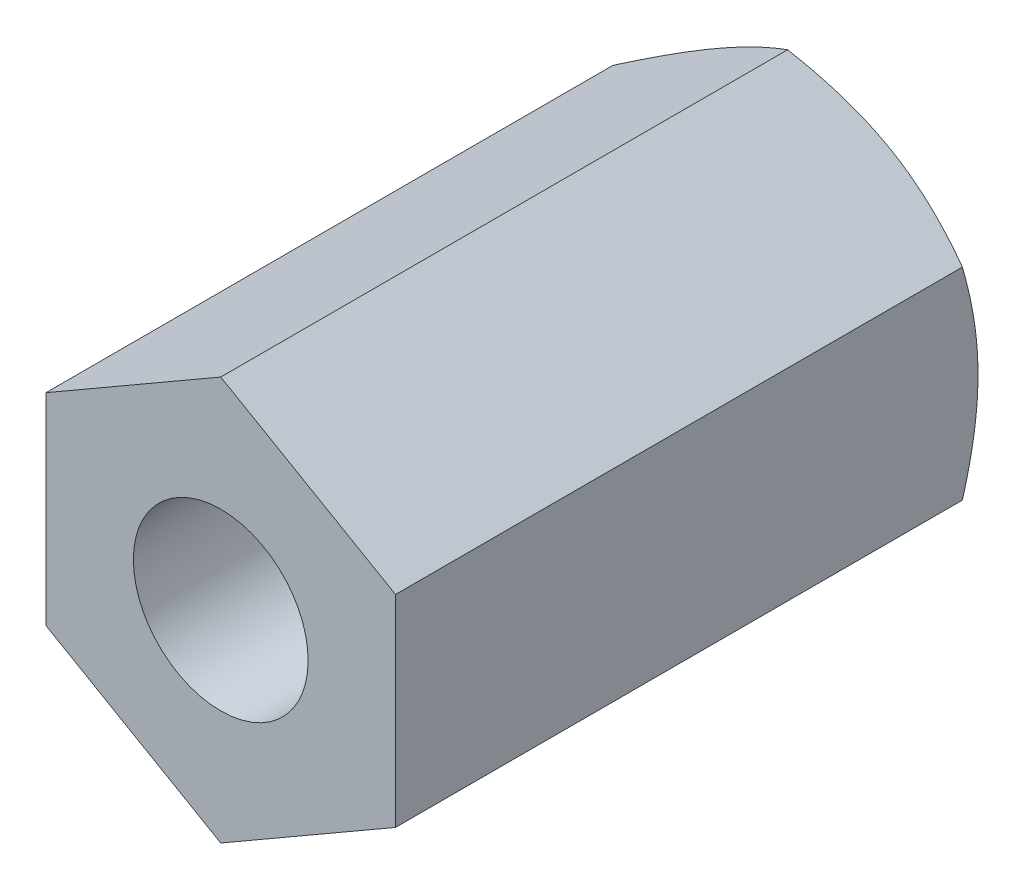
ISO-10303-21;
HEADER;
FILE_DESCRIPTION(('STEP AP214'),'2;1');
FILE_NAME('part.step','',(''),(''),'','','');
FILE_SCHEMA(('AUTOMOTIVE_DESIGN { 1 0 10303 214 1 1 1 1 }'));
ENDSEC;
DATA;
#1=APPLICATION_CONTEXT('core data for automotive mechanical design processes');
#2=APPLICATION_PROTOCOL_DEFINITION('international standard','automotive_design',2000,#1);
#3=PRODUCT_CONTEXT('',#1,'mechanical');
#4=PRODUCT('Part','Part','',(#3));
#5=PRODUCT_RELATED_PRODUCT_CATEGORY('part','',(#4));
#6=PRODUCT_DEFINITION_FORMATION('','',#4);
#7=PRODUCT_DEFINITION_CONTEXT('part definition',#1,'design');
#8=PRODUCT_DEFINITION('design','',#6,#7);
#9=PRODUCT_DEFINITION_SHAPE('','',#8);
#10=(LENGTH_UNIT() NAMED_UNIT(*) SI_UNIT(.MILLI.,.METRE.));
#11=(NAMED_UNIT(*) PLANE_ANGLE_UNIT() SI_UNIT($,.RADIAN.));
#12=(NAMED_UNIT(*) SI_UNIT($,.STERADIAN.) SOLID_ANGLE_UNIT());
#13=UNCERTAINTY_MEASURE_WITH_UNIT(LENGTH_MEASURE(1.E-05),#10,'distance_accuracy_value','');
#14=(GEOMETRIC_REPRESENTATION_CONTEXT(3) GLOBAL_UNCERTAINTY_ASSIGNED_CONTEXT((#13)) GLOBAL_UNIT_ASSIGNED_CONTEXT((#10,
#11,#12)) REPRESENTATION_CONTEXT('',''));
#15=CARTESIAN_POINT('',(0.,0.,0.));
#16=DIRECTION('',(0.,0.,1.));
#17=DIRECTION('',(1.,0.,0.));
#18=AXIS2_PLACEMENT_3D('',#15,#16,#17);
#19=CARTESIAN_POINT('',(3.,1.73205080756888,5.));
#20=DIRECTION('',(-0.499999999999999,-0.866025403784439,0.));
#21=DIRECTION('',(0.866025403784439,-0.499999999999999,0.));
#22=AXIS2_PLACEMENT_3D('',#19,#20,#21);
#23=PLANE('',#22);
#24=CARTESIAN_POINT('',(-0.000200000000001813,3.46421708519159,-4.73198413756899));
#25=CARTESIAN_POINT('',(0.13163520658833,3.38810199317915,-4.77594629554769));
#26=CARTESIAN_POINT('',(0.264608405355248,3.31132988107606,-4.81592841370737));
#27=CARTESIAN_POINT('',(0.532857420002054,3.15645624025988,-4.88571791955453));
#28=CARTESIAN_POINT('',(0.66813800263434,3.078351959461,-4.91550061773462));
#29=CARTESIAN_POINT('',(0.937022602096482,2.92311136358059,-4.96186216078874));
#30=CARTESIAN_POINT('',(1.07058524542946,2.84599893549862,-4.97874955887705));
#31=CARTESIAN_POINT('',(1.33833905729569,2.6914112001411,-4.99891035755148));
#32=CARTESIAN_POINT('',(1.47252925247984,2.61393645482892,-5.00220045221892));
#33=CARTESIAN_POINT('',(1.72327559769581,2.46916798492017,-4.99535946911461));
#34=CARTESIAN_POINT('',(1.83986926497267,2.40185259973206,-4.98690808580738));
#35=CARTESIAN_POINT('',(2.07229698497464,2.2676603930218,-4.96012105699297));
#36=CARTESIAN_POINT('',(2.18813023365133,2.2007840357172,-4.94177625913829));
#37=CARTESIAN_POINT('',(2.42103725705637,2.06631510305815,-4.89591524914667));
#38=CARTESIAN_POINT('',(2.53808155051394,1.99873954872331,-4.86820461473692));
#39=CARTESIAN_POINT('',(2.77042435049913,1.86459637060759,-4.8053122048626));
#40=CARTESIAN_POINT('',(2.88572583417111,1.79802702797161,-4.77014520897844));
#41=CARTESIAN_POINT('',(3.0002,1.73193533751504,-4.73198413756899));
#42=B_SPLINE_CURVE_WITH_KNOTS('',3,(#24,#25,#26,#27,#28,#29,#30,#31,#32,#33,#34,#35,#36,#37,#38,
#39,#40,#41),.UNSPECIFIED.,.F.,.F.,(4,2,2,2,2,2,2,2,4),(0.,0.475539830103041,0.952222784107964,
1.41710776961288,1.88142182298026,2.28572436316091,2.69040156475039,3.10405572063576,
3.5168974940707),.UNSPECIFIED.);
#43=CARTESIAN_POINT('',(0.,3.46410161513775,-4.73205080756888));
#44=VERTEX_POINT('',#43);
#45=CARTESIAN_POINT('',(1.5,2.59807621135332,-5.));
#46=VERTEX_POINT('',#45);
#47=EDGE_CURVE('E59',#44,#46,#42,.T.);
#48=ORIENTED_EDGE('',*,*,#47,.F.);
#49=DIRECTION('',(0.,0.,-1.));
#50=VECTOR('',#49,1.);
#51=CARTESIAN_POINT('',(0.,3.46410161513775,5.));
#52=LINE('',#51,#50);
#53=CARTESIAN_POINT('',(0.,3.46410161513775,5.));
#54=VERTEX_POINT('',#53);
#55=EDGE_CURVE('E152',#54,#44,#52,.T.);
#56=ORIENTED_EDGE('',*,*,#55,.F.);
#57=DIRECTION('',(-0.866025403784439,0.499999999999999,0.));
#58=VECTOR('',#57,1.);
#59=CARTESIAN_POINT('',(3.,1.73205080756888,5.));
#60=LINE('',#59,#58);
#61=CARTESIAN_POINT('',(3.,1.73205080756888,5.));
#62=VERTEX_POINT('',#61);
#63=EDGE_CURVE('E244',#62,#54,#60,.T.);
#64=ORIENTED_EDGE('',*,*,#63,.F.);
#65=DIRECTION('',(0.,0.,-1.));
#66=VECTOR('',#65,1.);
#67=CARTESIAN_POINT('',(3.,1.73205080756888,5.));
#68=LINE('',#67,#66);
#69=CARTESIAN_POINT('',(3.,1.73205080756888,-4.73205080756888));
#70=VERTEX_POINT('',#69);
#71=EDGE_CURVE('E145',#62,#70,#68,.T.);
#72=ORIENTED_EDGE('',*,*,#71,.T.);
#73=EDGE_CURVE('E137',#46,#70,#42,.T.);
#74=ORIENTED_EDGE('',*,*,#73,.F.);
#75=EDGE_LOOP('',(#48,#56,#64,#72,#74));
#76=FACE_BOUND('',#75,.T.);
#77=ADVANCED_FACE('F45',(#76),#23,.F.);
#78=CARTESIAN_POINT('',(0.,3.46410161513775,5.));
#79=DIRECTION('',(0.5,-0.866025403784438,0.));
#80=DIRECTION('',(0.866025403784438,0.5,0.));
#81=AXIS2_PLACEMENT_3D('',#78,#79,#80);
#82=PLANE('',#81);
#83=CARTESIAN_POINT('',(-3.0002,1.73193533751504,-4.73198413756899));
#84=CARTESIAN_POINT('',(-2.86836479341167,1.80805042952748,-4.77594629554769));
#85=CARTESIAN_POINT('',(-2.73539159464475,1.88482254163057,-4.81592841370737));
#86=CARTESIAN_POINT('',(-2.46714257999794,2.03969618244675,-4.88571791955454));
#87=CARTESIAN_POINT('',(-2.33186199736566,2.11780046324563,-4.91550061773462));
#88=CARTESIAN_POINT('',(-2.06297739790352,2.27304105912605,-4.96186216078874));
#89=CARTESIAN_POINT('',(-1.92941475457054,2.35015348720802,-4.97874955887705));
#90=CARTESIAN_POINT('',(-1.66166094270431,2.50474122256553,-4.99891035755148));
#91=CARTESIAN_POINT('',(-1.52747074752016,2.58221596787771,-5.00220045221892));
#92=CARTESIAN_POINT('',(-1.27672440230419,2.72698443778646,-4.99535946911461));
#93=CARTESIAN_POINT('',(-1.16013073502732,2.79429982297457,-4.98690808580738));
#94=CARTESIAN_POINT('',(-0.927703015025365,2.92849202968483,-4.96012105699297));
#95=CARTESIAN_POINT('',(-0.81186976634867,2.99536838698943,-4.94177625913829));
#96=CARTESIAN_POINT('',(-0.578962742943634,3.12983731964848,-4.89591524914667));
#97=CARTESIAN_POINT('',(-0.461918449486061,3.19741287398332,-4.86820461473692));
#98=CARTESIAN_POINT('',(-0.229575649500877,3.33155605209904,-4.8053122048626));
#99=CARTESIAN_POINT('',(-0.114274165828896,3.39812539473502,-4.77014520897844));
#100=CARTESIAN_POINT('',(0.000199999999997777,3.46421708519159,-4.73198413756899));
#101=B_SPLINE_CURVE_WITH_KNOTS('',3,(#83,#84,#85,#86,#87,#88,#89,#90,#91,#92,#93,#94,#95,#96,
#97,#98,#99,#100),.UNSPECIFIED.,.F.,.F.,(4,2,2,2,2,2,2,2,4),(0.,0.475539830103041,
0.952222784107964,1.41710776961288,1.88142182298026,2.28572436316091,2.69040156475039,
3.10405572063576,3.5168974940707),.UNSPECIFIED.);
#102=CARTESIAN_POINT('',(-3.,1.73205080756888,-4.73205080756888));
#103=VERTEX_POINT('',#102);
#104=CARTESIAN_POINT('',(-1.5,2.59807621135332,-5.));
#105=VERTEX_POINT('',#104);
#106=EDGE_CURVE('E61',#103,#105,#101,.T.);
#107=ORIENTED_EDGE('',*,*,#106,.F.);
#108=DIRECTION('',(0.,0.,-1.));
#109=VECTOR('',#108,1.);
#110=CARTESIAN_POINT('',(-3.,1.73205080756888,5.));
#111=LINE('',#110,#109);
#112=CARTESIAN_POINT('',(-3.,1.73205080756888,5.));
#113=VERTEX_POINT('',#112);
#114=EDGE_CURVE('E155',#113,#103,#111,.T.);
#115=ORIENTED_EDGE('',*,*,#114,.F.);
#116=DIRECTION('',(-0.866025403784438,-0.5,0.));
#117=VECTOR('',#116,1.);
#118=CARTESIAN_POINT('',(0.,3.46410161513775,5.));
#119=LINE('',#118,#117);
#120=EDGE_CURVE('E243',#54,#113,#119,.T.);
#121=ORIENTED_EDGE('',*,*,#120,.F.);
#122=ORIENTED_EDGE('',*,*,#55,.T.);
#123=EDGE_CURVE('E169',#105,#44,#101,.T.);
#124=ORIENTED_EDGE('',*,*,#123,.F.);
#125=EDGE_LOOP('',(#107,#115,#121,#122,#124));
#126=FACE_BOUND('',#125,.T.);
#127=ADVANCED_FACE('F174',(#126),#82,.F.);
#128=CARTESIAN_POINT('',(-3.,1.73205080756888,5.));
#129=DIRECTION('',(1.,0.,0.));
#130=DIRECTION('',(0.,0.,-1.));
#131=AXIS2_PLACEMENT_3D('',#128,#129,#130);
#132=PLANE('',#131);
#133=CARTESIAN_POINT('',(-3.,-17.0986930271428,3.29067841549304));
#134=CARTESIAN_POINT('',(-3.,-16.5661103428008,2.98784229867591));
#135=CARTESIAN_POINT('',(-3.,-16.033365391056,2.6852903923022));
#136=CARTESIAN_POINT('',(-3.,-14.9667886017206,2.08070715643592));
#137=CARTESIAN_POINT('',(-3.,-14.4329562155798,1.77867679487407));
#138=CARTESIAN_POINT('',(-3.,-13.352647761221,1.16900379076196));
#139=CARTESIAN_POINT('',(-3.,-12.8061568867149,0.86138737060701));
#140=CARTESIAN_POINT('',(-3.,-11.7128183365851,0.24823332707843));
#141=CARTESIAN_POINT('',(-3.,-11.1659717571849,-0.0573062483819965));
#142=CARTESIAN_POINT('',(-3.,-10.240652439692,-0.571409925426077));
#143=CARTESIAN_POINT('',(-3.,-9.86256119353648,-0.78066029601164));
#144=CARTESIAN_POINT('',(-3.,-9.1054312742815,-1.19743913879986));
#145=CARTESIAN_POINT('',(-3.,-8.72639260479033,-1.40496761754745));
#146=CARTESIAN_POINT('',(-3.,-7.96546318845327,-1.81839754195755));
#147=CARTESIAN_POINT('',(-3.,-7.58356709774657,-2.02428916214036));
#148=CARTESIAN_POINT('',(-3.,-6.81795402493175,-2.43233757901441));
#149=CARTESIAN_POINT('',(-3.,-6.43423776029363,-2.63449571484276));
#150=CARTESIAN_POINT('',(-3.,-5.85971803000353,-2.93164142809243));
#151=CARTESIAN_POINT('',(-3.,-5.67005981376972,-3.02884126328336));
#152=CARTESIAN_POINT('',(-3.,-5.28981734420958,-3.22141007804521));
#153=CARTESIAN_POINT('',(-3.,-5.09923310329799,-3.31677908207676));
#154=CARTESIAN_POINT('',(-3.,-4.71659417975172,-3.50527301981032));
#155=CARTESIAN_POINT('',(-3.,-4.52453769986071,-3.59839431503987));
#156=CARTESIAN_POINT('',(-3.,-4.13890954850645,-3.78142924850615));
#157=CARTESIAN_POINT('',(-3.,-3.94533796761318,-3.87134307672044));
#158=CARTESIAN_POINT('',(-3.,-3.55764682838599,-4.04614454487251));
#159=CARTESIAN_POINT('',(-3.,-3.36354187622502,-4.1310644019764));
#160=CARTESIAN_POINT('',(-3.,-2.97271984041441,-4.29490883972565));
#161=CARTESIAN_POINT('',(-3.,-2.77600197388366,-4.37383157363454));
#162=CARTESIAN_POINT('',(-3.,-2.37983500647173,-4.52289825847523));
#163=CARTESIAN_POINT('',(-3.,-2.18039459395595,-4.59306507195304));
#164=CARTESIAN_POINT('',(-3.,-1.77763817135805,-4.72109585088445));
#165=CARTESIAN_POINT('',(-3.,-1.57432556618919,-4.77897012635428));
#166=CARTESIAN_POINT('',(-3.,-1.33221889720849,-4.83699638847255));
#167=CARTESIAN_POINT('',(-3.,-1.29540371620754,-4.8455270709847));
#168=CARTESIAN_POINT('',(-3.,-1.22163788190301,-4.86200259594439));
#169=CARTESIAN_POINT('',(-3.,-1.18468721373361,-4.86994737195572));
#170=CARTESIAN_POINT('',(-3.,-1.07362214090964,-4.89285867757023));
#171=CARTESIAN_POINT('',(-3.,-0.999313453309902,-4.90689765055655));
#172=CARTESIAN_POINT('',(-3.,-0.850267786489996,-4.93224645860469));
#173=CARTESIAN_POINT('',(-3.,-0.775531033588518,-4.94355762006135));
#174=CARTESIAN_POINT('',(-3.,-0.625671663320719,-4.96323372853169));
#175=CARTESIAN_POINT('',(-3.,-0.550549064515344,-4.97159881594288));
#176=CARTESIAN_POINT('',(-3.,-0.401660831862149,-4.98504879088572));
#177=CARTESIAN_POINT('',(-3.,-0.327901371179909,-4.99020129292334));
#178=CARTESIAN_POINT('',(-3.,-0.180237023060515,-4.99739802688832));
#179=CARTESIAN_POINT('',(-3.,-0.106332138803016,-4.99944232603608));
#180=CARTESIAN_POINT('',(-3.,0.115497020679267,-5.00081251825929));
#181=CARTESIAN_POINT('',(-3.,0.263483673421842,-4.99537089968712));
#182=CARTESIAN_POINT('',(-3.,0.513790739213511,-4.97577315197662));
#183=CARTESIAN_POINT('',(-3.,0.616378215884685,-4.964752546432));
#184=CARTESIAN_POINT('',(-3.,0.820826504439455,-4.93725430060879));
#185=CARTESIAN_POINT('',(-3.,0.922687223712045,-4.92077597710452));
#186=CARTESIAN_POINT('',(-3.,1.22695123363567,-4.86402718131061));
#187=CARTESIAN_POINT('',(-3.,1.42800642804249,-4.81644554442191));
#188=CARTESIAN_POINT('',(-3.,1.7292372042123,-4.7335371863521));
#189=CARTESIAN_POINT('',(-3.,1.83095426350463,-4.70349229885166));
#190=CARTESIAN_POINT('',(-3.,2.03339809348481,-4.6402040312608));
#191=CARTESIAN_POINT('',(-3.,2.13412485503417,-4.60696062168483));
#192=CARTESIAN_POINT('',(-3.,2.33463848487601,-4.53781057510983));
#193=CARTESIAN_POINT('',(-3.,2.43442546026586,-4.50190424581731));
#194=CARTESIAN_POINT('',(-3.,2.63316333432947,-4.42786698187536));
#195=CARTESIAN_POINT('',(-3.,2.73211426932931,-4.38973614445615));
#196=CARTESIAN_POINT('',(-3.,2.94713057294748,-4.30454189247385));
#197=CARTESIAN_POINT('',(-3.,3.06305011805281,-4.25711135577755));
#198=CARTESIAN_POINT('',(-3.,3.29400431024234,-4.16013840215636));
#199=CARTESIAN_POINT('',(-3.,3.40903892011853,-4.11059589699833));
#200=CARTESIAN_POINT('',(-3.,3.75304841249037,-3.959377677216));
#201=CARTESIAN_POINT('',(-3.,3.98089056682614,-3.85512678034366));
#202=CARTESIAN_POINT('',(-3.,4.43449721992821,-3.6418775027275));
#203=CARTESIAN_POINT('',(-3.,4.66026030771364,-3.532876149762));
#204=CARTESIAN_POINT('',(-3.,5.11014926485069,-3.31153505936299));
#205=CARTESIAN_POINT('',(-3.,5.33427507792373,-3.1991952078406));
#206=CARTESIAN_POINT('',(-3.,5.78178841571741,-2.9718305221437));
#207=CARTESIAN_POINT('',(-3.,6.00517316357419,-2.85680023913259));
#208=CARTESIAN_POINT('',(-3.,6.45099145397736,-2.62490330313413));
#209=CARTESIAN_POINT('',(-3.,6.67342497730214,-2.50803661325904));
#210=CARTESIAN_POINT('',(-3.,7.33944414104868,-2.15545170734486));
#211=CARTESIAN_POINT('',(-3.,7.78192897860615,-1.9176559134942));
#212=CARTESIAN_POINT('',(-3.,8.59840366689875,-1.47479119043307));
#213=CARTESIAN_POINT('',(-3.,8.97265323805835,-1.27019884122012));
#214=CARTESIAN_POINT('',(-3.,9.7202319713278,-0.85923681146449));
#215=CARTESIAN_POINT('',(-3.,10.0935610210715,-0.652866926538021));
#216=CARTESIAN_POINT('',(-3.,10.8379475919816,-0.239731824583686));
#217=CARTESIAN_POINT('',(-3.,11.209008064221,-0.0329719177156139));
#218=CARTESIAN_POINT('',(-3.,11.9505442383162,0.381483653944557));
#219=CARTESIAN_POINT('',(-3.,12.3210200085796,0.589179196305344));
#220=CARTESIAN_POINT('',(-3.,12.6913069702878,0.79720928476588));
#221=B_SPLINE_CURVE_WITH_KNOTS('',3,(#133,#134,#135,#136,#137,#138,#139,#140,#141,#142,#143,
#144,#145,#146,#147,#148,#149,#150,#151,#152,#153,#154,#155,#156,#157,#158,#159,#160,#161,#162,
#163,#164,#165,#166,#167,#168,#169,#170,#171,#172,#173,#174,#175,#176,#177,#178,#179,#180,#181,
#182,#183,#184,#185,#186,#187,#188,#189,#190,#191,#192,#193,#194,#195,#196,#197,#198,#199,#200,
#201,#202,#203,#204,#205,#206,#207,#208,#209,#210,#211,#212,#213,#214,#215,#216,#217,#218,#219,
#220),.UNSPECIFIED.,.F.,.F.,(4,2,2,2,2,2,2,2,2,2,2,2,2,2,2,2,2,2,2,2,2,2,2,2,2,2,2,2,2,2,2,2,2,
2,2,2,2,2,2,2,2,2,2,4),(0.,1.83798509267449,3.67803694612074,5.55939658542061,7.43863593871336,
8.73503125812097,10.0314216476586,11.3329963728627,12.6340948044639,13.2734328681558,
13.912762384087,14.5530654833894,15.1933305944988,15.8288669138387,16.4645981518729,
17.0986330655495,17.7321340820776,17.84550242963,17.9588836123718,18.1857039242984,
18.4124137217518,18.6391127137066,18.8608633242803,19.0826091390365,19.5262573101369,
19.8356486289578,20.1450786936513,20.7640286114441,21.0821847027568,21.4003437272709,
21.7184660448865,22.0365744682119,22.412291186182,22.788023616136,23.5396126482428,
24.2916788752178,25.0437708327069,25.7975468391129,26.5513380059525,28.0583113205144,
29.3378722862966,30.6175823959937,31.8919120749012,33.1660795848578),.UNSPECIFIED.);
#222=CARTESIAN_POINT('',(-3.,-1.73205080756888,-4.73205080756888));
#223=VERTEX_POINT('',#222);
#224=CARTESIAN_POINT('',(-3.,0.,-5.));
#225=VERTEX_POINT('',#224);
#226=EDGE_CURVE('E253',#223,#225,#221,.T.);
#227=ORIENTED_EDGE('',*,*,#226,.F.);
#228=DIRECTION('',(0.,0.,-1.));
#229=VECTOR('',#228,1.);
#230=CARTESIAN_POINT('',(-3.,-1.73205080756888,5.));
#231=LINE('',#230,#229);
#232=CARTESIAN_POINT('',(-3.,-1.73205080756888,5.));
#233=VERTEX_POINT('',#232);
#234=EDGE_CURVE('E144',#233,#223,#231,.T.);
#235=ORIENTED_EDGE('',*,*,#234,.F.);
#236=DIRECTION('',(0.,-1.,0.));
#237=VECTOR('',#236,1.);
#238=CARTESIAN_POINT('',(-3.,1.73205080756888,5.));
#239=LINE('',#238,#237);
#240=EDGE_CURVE('E237',#113,#233,#239,.T.);
#241=ORIENTED_EDGE('',*,*,#240,.F.);
#242=ORIENTED_EDGE('',*,*,#114,.T.);
#243=EDGE_CURVE('E192',#225,#103,#221,.T.);
#244=ORIENTED_EDGE('',*,*,#243,.F.);
#245=EDGE_LOOP('',(#227,#235,#241,#242,#244));
#246=FACE_BOUND('',#245,.T.);
#247=ADVANCED_FACE('F261',(#246),#132,.F.);
#248=CARTESIAN_POINT('',(-3.,-1.73205080756888,5.));
#249=DIRECTION('',(0.499999999999999,0.866025403784439,0.));
#250=DIRECTION('',(-0.866025403784439,0.499999999999999,0.));
#251=AXIS2_PLACEMENT_3D('',#248,#249,#250);
#252=PLANE('',#251);
#253=CARTESIAN_POINT('',(0.000200000000002435,-3.46421708519159,-4.73198413756899));
#254=CARTESIAN_POINT('',(-0.131635206588329,-3.38810199317915,-4.77594629554769));
#255=CARTESIAN_POINT('',(-0.264608405355247,-3.31132988107606,-4.81592841370737));
#256=CARTESIAN_POINT('',(-0.532857420002053,-3.15645624025988,-4.88571791955453));
#257=CARTESIAN_POINT('',(-0.668138002634339,-3.078351959461,-4.91550061773462));
#258=CARTESIAN_POINT('',(-0.937022602096481,-2.92311136358059,-4.96186216078874));
#259=CARTESIAN_POINT('',(-1.07058524542946,-2.84599893549862,-4.97874955887705));
#260=CARTESIAN_POINT('',(-1.33833905729569,-2.6914112001411,-4.99891035755148));
#261=CARTESIAN_POINT('',(-1.47252925247984,-2.61393645482892,-5.00220045221892));
#262=CARTESIAN_POINT('',(-1.7232755976958,-2.46916798492017,-4.99535946911461));
#263=CARTESIAN_POINT('',(-1.83986926497267,-2.40185259973206,-4.98690808580738));
#264=CARTESIAN_POINT('',(-2.07229698497463,-2.2676603930218,-4.96012105699297));
#265=CARTESIAN_POINT('',(-2.18813023365133,-2.2007840357172,-4.94177625913829));
#266=CARTESIAN_POINT('',(-2.42103725705637,-2.06631510305815,-4.89591524914667));
#267=CARTESIAN_POINT('',(-2.53808155051394,-1.99873954872331,-4.86820461473692));
#268=CARTESIAN_POINT('',(-2.77042435049912,-1.86459637060759,-4.8053122048626));
#269=CARTESIAN_POINT('',(-2.88572583417111,-1.79802702797161,-4.77014520897844));
#270=CARTESIAN_POINT('',(-3.0002,-1.73193533751504,-4.73198413756899));
#271=B_SPLINE_CURVE_WITH_KNOTS('',3,(#253,#254,#255,#256,#257,#258,#259,#260,#261,#262,#263,
#264,#265,#266,#267,#268,#269,#270),.UNSPECIFIED.,.F.,.F.,(4,2,2,2,2,2,2,2,4),(0.,
0.47553983010304,0.952222784107964,1.41710776961288,1.88142182298026,2.28572436316091,
2.69040156475039,3.10405572063576,3.5168974940707),.UNSPECIFIED.);
#272=CARTESIAN_POINT('',(0.,-3.46410161513775,-4.73205080756888));
#273=VERTEX_POINT('',#272);
#274=CARTESIAN_POINT('',(-1.5,-2.59807621135332,-5.));
#275=VERTEX_POINT('',#274);
#276=EDGE_CURVE('E180',#273,#275,#271,.T.);
#277=ORIENTED_EDGE('',*,*,#276,.F.);
#278=DIRECTION('',(0.,0.,-1.));
#279=VECTOR('',#278,1.);
#280=CARTESIAN_POINT('',(0.,-3.46410161513775,5.));
#281=LINE('',#280,#279);
#282=CARTESIAN_POINT('',(0.,-3.46410161513775,5.));
#283=VERTEX_POINT('',#282);
#284=EDGE_CURVE('E142',#283,#273,#281,.T.);
#285=ORIENTED_EDGE('',*,*,#284,.F.);
#286=DIRECTION('',(0.866025403784439,-0.499999999999999,0.));
#287=VECTOR('',#286,1.);
#288=CARTESIAN_POINT('',(-3.,-1.73205080756888,5.));
#289=LINE('',#288,#287);
#290=EDGE_CURVE('E240',#233,#283,#289,.T.);
#291=ORIENTED_EDGE('',*,*,#290,.F.);
#292=ORIENTED_EDGE('',*,*,#234,.T.);
#293=EDGE_CURVE('E177',#275,#223,#271,.T.);
#294=ORIENTED_EDGE('',*,*,#293,.F.);
#295=EDGE_LOOP('',(#277,#285,#291,#292,#294));
#296=FACE_BOUND('',#295,.T.);
#297=ADVANCED_FACE('F231',(#296),#252,.F.);
#298=CARTESIAN_POINT('',(0.,-3.46410161513775,5.));
#299=DIRECTION('',(-0.5,0.866025403784438,0.));
#300=DIRECTION('',(-0.866025403784438,-0.5,0.));
#301=AXIS2_PLACEMENT_3D('',#298,#299,#300);
#302=PLANE('',#301);
#303=CARTESIAN_POINT('',(3.0002,-1.73193533751504,-4.73198413756899));
#304=CARTESIAN_POINT('',(2.86836479341167,-1.80805042952748,-4.77594629554769));
#305=CARTESIAN_POINT('',(2.73539159464475,-1.88482254163057,-4.81592841370737));
#306=CARTESIAN_POINT('',(2.46714257999795,-2.03969618244675,-4.88571791955453));
#307=CARTESIAN_POINT('',(2.33186199736566,-2.11780046324563,-4.91550061773462));
#308=CARTESIAN_POINT('',(2.06297739790352,-2.27304105912605,-4.96186216078874));
#309=CARTESIAN_POINT('',(1.92941475457054,-2.35015348720802,-4.97874955887705));
#310=CARTESIAN_POINT('',(1.66166094270431,-2.50474122256553,-4.99891035755148));
#311=CARTESIAN_POINT('',(1.52747074752016,-2.58221596787771,-5.00220045221892));
#312=CARTESIAN_POINT('',(1.2767244023042,-2.72698443778646,-4.99535946911461));
#313=CARTESIAN_POINT('',(1.16013073502733,-2.79429982297457,-4.98690808580738));
#314=CARTESIAN_POINT('',(0.927703015025366,-2.92849202968483,-4.96012105699297));
#315=CARTESIAN_POINT('',(0.811869766348671,-2.99536838698943,-4.94177625913829));
#316=CARTESIAN_POINT('',(0.578962742943634,-3.12983731964848,-4.89591524914667));
#317=CARTESIAN_POINT('',(0.461918449486061,-3.19741287398332,-4.86820461473692));
#318=CARTESIAN_POINT('',(0.229575649500877,-3.33155605209904,-4.8053122048626));
#319=CARTESIAN_POINT('',(0.114274165828896,-3.39812539473502,-4.77014520897844));
#320=CARTESIAN_POINT('',(-0.000199999999997742,-3.46421708519159,-4.73198413756899));
#321=B_SPLINE_CURVE_WITH_KNOTS('',3,(#303,#304,#305,#306,#307,#308,#309,#310,#311,#312,#313,
#314,#315,#316,#317,#318,#319,#320),.UNSPECIFIED.,.F.,.F.,(4,2,2,2,2,2,2,2,4),(0.,
0.47553983010304,0.952222784107965,1.41710776961288,1.88142182298026,2.28572436316091,
2.69040156475039,3.10405572063576,3.5168974940707),.UNSPECIFIED.);
#322=CARTESIAN_POINT('',(3.,-1.73205080756913,-4.73205080756905));
#323=VERTEX_POINT('',#322);
#324=CARTESIAN_POINT('',(1.5,-2.59807621135332,-5.));
#325=VERTEX_POINT('',#324);
#326=EDGE_CURVE('E117',#323,#325,#321,.T.);
#327=ORIENTED_EDGE('',*,*,#326,.F.);
#328=DIRECTION('',(0.,0.,-1.));
#329=VECTOR('',#328,1.);
#330=CARTESIAN_POINT('',(3.,-1.73205080756888,5.));
#331=LINE('',#330,#329);
#332=CARTESIAN_POINT('',(3.,-1.73205080756888,5.));
#333=VERTEX_POINT('',#332);
#334=EDGE_CURVE('E135',#333,#323,#331,.T.);
#335=ORIENTED_EDGE('',*,*,#334,.F.);
#336=DIRECTION('',(0.866025403784438,0.5,0.));
#337=VECTOR('',#336,1.);
#338=CARTESIAN_POINT('',(0.,-3.46410161513775,5.));
#339=LINE('',#338,#337);
#340=EDGE_CURVE('E232',#283,#333,#339,.T.);
#341=ORIENTED_EDGE('',*,*,#340,.F.);
#342=ORIENTED_EDGE('',*,*,#284,.T.);
#343=EDGE_CURVE('E134',#325,#273,#321,.T.);
#344=ORIENTED_EDGE('',*,*,#343,.F.);
#345=EDGE_LOOP('',(#327,#335,#341,#342,#344));
#346=FACE_BOUND('',#345,.T.);
#347=ADVANCED_FACE('F126',(#346),#302,.F.);
#348=CARTESIAN_POINT('',(3.,-1.73205080756888,5.));
#349=DIRECTION('',(-1.,0.,0.));
#350=DIRECTION('',(0.,-1.,0.));
#351=AXIS2_PLACEMENT_3D('',#348,#349,#350);
#352=PLANE('',#351);
#353=CARTESIAN_POINT('',(3.00000000000001,-17.0986930308748,3.29067841761533));
#354=CARTESIAN_POINT('',(3.00000000000001,-16.566110346433,2.9878423007394));
#355=CARTESIAN_POINT('',(3.,-16.0333653945883,2.68529039430682));
#356=CARTESIAN_POINT('',(3.,-14.9667886050531,2.08070715832246));
#357=CARTESIAN_POINT('',(3.,-14.4329562188124,1.77867679670141));
#358=CARTESIAN_POINT('',(3.,-13.3526477642528,1.16900379246986));
#359=CARTESIAN_POINT('',(3.,-12.8061568896458,0.861387372254673));
#360=CARTESIAN_POINT('',(3.,-11.7128183393147,0.24823332860521));
#361=CARTESIAN_POINT('',(3.,-11.1659717598141,-0.0573062469158566));
#362=CARTESIAN_POINT('',(3.,-10.2406524421213,-0.571409924080025));
#363=CARTESIAN_POINT('',(3.,-9.86256119586624,-0.780660294724726));
#364=CARTESIAN_POINT('',(3.,-9.10543127641219,-1.19743913763144));
#365=CARTESIAN_POINT('',(3.,-8.72639260682154,-1.40496761643839));
#366=CARTESIAN_POINT('',(3.,-7.96546319028502,-1.8183975409678));
#367=CARTESIAN_POINT('',(3.,-7.58356709947834,-2.02428916121058));
#368=CARTESIAN_POINT('',(3.,-6.81795402646375,-2.43233757820478));
#369=CARTESIAN_POINT('',(3.,-6.43423776172583,-2.63449571409331));
#370=CARTESIAN_POINT('',(3.,-5.85971803128698,-2.93164142743285));
#371=CARTESIAN_POINT('',(3.,-5.67005981500422,-3.02884126265337));
#372=CARTESIAN_POINT('',(3.,-5.28981734534615,-3.22141007747443));
#373=CARTESIAN_POINT('',(3.,-5.09923310438557,-3.31677908153558));
#374=CARTESIAN_POINT('',(3.,-4.71659418074105,-3.50527301932839));
#375=CARTESIAN_POINT('',(3.,-4.52453770080078,-3.59839431458757));
#376=CARTESIAN_POINT('',(3.,-4.13890954934781,-3.78142924811291));
#377=CARTESIAN_POINT('',(3.,-3.94533796840508,-3.87134307635662));
#378=CARTESIAN_POINT('',(3.,-3.55764682907924,-4.04614454456667));
#379=CARTESIAN_POINT('',(3.,-3.36354187686908,-4.13106440169913));
#380=CARTESIAN_POINT('',(3.,-2.97271984095934,-4.29490883950447));
#381=CARTESIAN_POINT('',(3.,-2.77600197437866,-4.37383157344088));
#382=CARTESIAN_POINT('',(3.,-2.37983500686601,-4.52289825833427));
#383=CARTESIAN_POINT('',(3.,-2.18039459429945,-4.59306507183726));
#384=CARTESIAN_POINT('',(3.,-1.77763817159821,-4.72109585081468));
#385=CARTESIAN_POINT('',(3.,-1.5743255663768,-4.77897012630533));
#386=CARTESIAN_POINT('',(3.,-1.33221889733017,-4.83699638844409));
#387=CARTESIAN_POINT('',(3.,-1.29540371631692,-4.84552707095972));
#388=CARTESIAN_POINT('',(3.,-1.22163788198771,-4.86200259592602));
#389=CARTESIAN_POINT('',(3.,-1.18468721380592,-4.86994737194046));
#390=CARTESIAN_POINT('',(3.,-1.07362214094464,-4.89285867756371));
#391=CARTESIAN_POINT('',(3.,-0.999313453319843,-4.90689765055505));
#392=CARTESIAN_POINT('',(3.,-0.85026778644961,-4.93224645861137));
#393=CARTESIAN_POINT('',(3.,-0.775531033522863,-4.94355762007118));
#394=CARTESIAN_POINT('',(3.,-0.625671663204296,-4.96323372854576));
#395=CARTESIAN_POINT('',(3.,-0.550549064373423,-4.97159881595804));
#396=CARTESIAN_POINT('',(3.,-0.401660831670226,-4.98504879090077));
#397=CARTESIAN_POINT('',(3.,-0.327901370963485,-4.99020129293726));
#398=CARTESIAN_POINT('',(3.,-0.180237022795135,-4.99739802689787));
#399=CARTESIAN_POINT('',(3.,-0.106332138513181,-4.99944232604236));
#400=CARTESIAN_POINT('',(3.,0.115497021042322,-5.00081251825259));
#401=CARTESIAN_POINT('',(3.,0.263483673833418,-4.99537089966753));
#402=CARTESIAN_POINT('',(3.,0.513790739685336,-4.97577315193082));
#403=CARTESIAN_POINT('',(3.,0.616378216368783,-4.96475254637587));
#404=CARTESIAN_POINT('',(3.,0.820826504947553,-4.93725430053148));
#405=CARTESIAN_POINT('',(3.,0.92268722423187,-4.92077597701635));
#406=CARTESIAN_POINT('',(3.,1.22695123418998,-4.86402718118965));
#407=CARTESIAN_POINT('',(3.,1.42800642861887,-4.81644554427884));
#408=CARTESIAN_POINT('',(3.,1.72923720482206,-4.73353718617627));
#409=CARTESIAN_POINT('',(3.,1.830954264126,-4.70349229866473));
#410=CARTESIAN_POINT('',(3.,2.03339809412925,-4.64020403105201));
#411=CARTESIAN_POINT('',(3.,2.13412485569007,-4.60696062146527));
#412=CARTESIAN_POINT('',(3.,2.33463848555479,-4.5378105748691));
#413=CARTESIAN_POINT('',(3.,2.43442546095603,-4.50190424556618));
#414=CARTESIAN_POINT('',(3.,2.63316333504243,-4.42786698160378));
#415=CARTESIAN_POINT('',(3.,2.73211427005366,-4.38973614417452));
#416=CARTESIAN_POINT('',(3.,2.94713057371244,-4.30454189216441));
#417=CARTESIAN_POINT('',(3.,3.06305011884685,-4.25711135545007));
#418=CARTESIAN_POINT('',(3.,3.2940043110944,-4.16013840179269));
#419=CARTESIAN_POINT('',(3.,3.40903892099952,-4.11059589661651));
#420=CARTESIAN_POINT('',(3.,3.75304841345799,-3.95937767677969));
#421=CARTESIAN_POINT('',(3.,3.98089056785134,-3.85512677987097));
#422=CARTESIAN_POINT('',(3.,4.43449722106843,-3.64187750218223));
#423=CARTESIAN_POINT('',(3.,4.66026030891132,-3.53287614918054));
#424=CARTESIAN_POINT('',(3.,5.1101492661633,-3.31153505870942));
#425=CARTESIAN_POINT('',(3.,5.3342750792938,-3.19919520715111));
#426=CARTESIAN_POINT('',(3.,5.78178841720238,-2.97183052138265));
#427=CARTESIAN_POINT('',(3.,6.00517316511659,-2.85680023833592));
#428=CARTESIAN_POINT('',(3.,6.45099145563472,-2.62490330226644));
#429=CARTESIAN_POINT('',(3.,6.67342497901702,-2.50803661235597));
#430=CARTESIAN_POINT('',(3.,7.33944414293624,-2.15545170633594));
#431=CARTESIAN_POINT('',(3.,7.78192898060901,-1.91765591241512));
#432=CARTESIAN_POINT('',(3.,8.59840366910465,-1.47479118923047));
#433=CARTESIAN_POINT('',(3.,8.972653240352,-1.27019883996413));
#434=CARTESIAN_POINT('',(3.,9.72023197379714,-0.859236810102143));
#435=CARTESIAN_POINT('',(3.,10.0935610236288,-0.6528669251227));
#436=CARTESIAN_POINT('',(3.,10.8379475947154,-0.239731823062474));
#437=CARTESIAN_POINT('',(3.,11.2090080670434,-0.0329719161414813));
#438=CARTESIAN_POINT('',(3.,11.9505442413158,0.381483655624308));
#439=CARTESIAN_POINT('',(3.,12.3210200116679,0.589179198037792));
#440=CARTESIAN_POINT('',(3.,12.6913069734648,0.797209286550942));
#441=B_SPLINE_CURVE_WITH_KNOTS('',3,(#353,#354,#355,#356,#357,#358,#359,#360,#361,#362,#363,
#364,#365,#366,#367,#368,#369,#370,#371,#372,#373,#374,#375,#376,#377,#378,#379,#380,#381,#382,
#383,#384,#385,#386,#387,#388,#389,#390,#391,#392,#393,#394,#395,#396,#397,#398,#399,#400,#401,
#402,#403,#404,#405,#406,#407,#408,#409,#410,#411,#412,#413,#414,#415,#416,#417,#418,#419,#420,
#421,#422,#423,#424,#425,#426,#427,#428,#429,#430,#431,#432,#433,#434,#435,#436,#437,#438,#439,
#440),.UNSPECIFIED.,.F.,.F.,(4,2,2,2,2,2,2,2,2,2,2,2,2,2,2,2,2,2,2,2,2,2,2,2,2,2,2,2,2,2,2,2,2,
2,2,2,2,2,2,2,2,2,2,4),(0.,1.83798509302224,3.67803694681684,5.55939658646907,7.43863594011357,
8.73503125986848,10.0314216497535,11.3329963753069,12.6340948072572,13.2734328711202,
13.9127623872226,14.5530654866967,15.1933305979779,15.8288669174874,16.4645981556913,
17.0986330695366,17.732134086233,17.8455024338238,17.9588836166038,18.1857039286071,
18.4124137261368,18.6391127181679,18.8608633288146,19.0826091436438,19.5262573148905,
19.8356486337514,20.1450786984848,20.7640286163574,21.0821847077129,21.4003437322698,
21.7184660499282,22.0365744732963,22.4122911913677,22.788023621423,23.5396126537322,
24.2916788809097,25.0437708386012,25.7975468452093,26.551338012251,28.0583113272172,
29.3378722933072,30.6175824033121,31.891912082529,33.166079592795),.UNSPECIFIED.);
#442=CARTESIAN_POINT('',(3.,0.,-5.));
#443=VERTEX_POINT('',#442);
#444=EDGE_CURVE('E121',#70,#443,#441,.F.);
#445=ORIENTED_EDGE('',*,*,#444,.F.);
#446=ORIENTED_EDGE('',*,*,#71,.F.);
#447=DIRECTION('',(0.,1.,0.));
#448=VECTOR('',#447,1.);
#449=CARTESIAN_POINT('',(3.,-1.73205080756888,5.));
#450=LINE('',#449,#448);
#451=EDGE_CURVE('E138',#333,#62,#450,.T.);
#452=ORIENTED_EDGE('',*,*,#451,.F.);
#453=ORIENTED_EDGE('',*,*,#334,.T.);
#454=EDGE_CURVE('E114',#443,#323,#441,.F.);
#455=ORIENTED_EDGE('',*,*,#454,.F.);
#456=EDGE_LOOP('',(#445,#446,#452,#453,#455));
#457=FACE_BOUND('',#456,.T.);
#458=ADVANCED_FACE('F139',(#457),#352,.F.);
#459=CARTESIAN_POINT('',(0.,3.46410161513776,-5.));
#460=DIRECTION('',(0.,0.,1.));
#461=DIRECTION('',(1.,0.,0.));
#462=AXIS2_PLACEMENT_3D('',#459,#460,#461);
#463=PLANE('',#462);
#464=CARTESIAN_POINT('',(0.,0.,-5.));
#465=DIRECTION('',(0.,0.,-1.));
#466=DIRECTION('',(-1.,0.,0.));
#467=AXIS2_PLACEMENT_3D('',#464,#465,#466);
#468=CIRCLE('',#467,1.5508);
#469=CARTESIAN_POINT('',(-1.5508,0.,-5.));
#470=VERTEX_POINT('',#469);
#471=EDGE_CURVE('E254',#470,#470,#468,.T.);
#472=ORIENTED_EDGE('',*,*,#471,.F.);
#473=EDGE_LOOP('',(#472));
#474=FACE_BOUND('',#473,.T.);
#475=CARTESIAN_POINT('',(0.,0.,-5.));
#476=DIRECTION('',(0.,0.,1.));
#477=DIRECTION('',(1.,0.,0.));
#478=AXIS2_PLACEMENT_3D('',#475,#476,#477);
#479=CIRCLE('',#478,3.);
#480=EDGE_CURVE('E12',#443,#46,#479,.T.);
#481=ORIENTED_EDGE('',*,*,#480,.F.);
#482=EDGE_CURVE('E46',#325,#443,#479,.T.);
#483=ORIENTED_EDGE('',*,*,#482,.F.);
#484=EDGE_CURVE('E156',#275,#325,#479,.T.);
#485=ORIENTED_EDGE('',*,*,#484,.F.);
#486=EDGE_CURVE('E158',#225,#275,#479,.T.);
#487=ORIENTED_EDGE('',*,*,#486,.F.);
#488=CARTESIAN_POINT('',(0.,0.,-5.));
#489=DIRECTION('',(0.,0.,-1.));
#490=DIRECTION('',(-1.,0.,0.));
#491=AXIS2_PLACEMENT_3D('',#488,#489,#490);
#492=CIRCLE('',#491,3.);
#493=EDGE_CURVE('E123',#225,#105,#492,.T.);
#494=ORIENTED_EDGE('',*,*,#493,.T.);
#495=EDGE_CURVE('E51',#46,#105,#479,.T.);
#496=ORIENTED_EDGE('',*,*,#495,.F.);
#497=EDGE_LOOP('',(#481,#483,#485,#487,#494,#496));
#498=FACE_BOUND('',#497,.T.);
#499=ADVANCED_FACE('F175',(#474,#498),#463,.F.);
#500=CARTESIAN_POINT('',(0.,3.46410161513776,5.));
#501=DIRECTION('',(0.,0.,1.));
#502=DIRECTION('',(1.,0.,0.));
#503=AXIS2_PLACEMENT_3D('',#500,#501,#502);
#504=PLANE('',#503);
#505=ORIENTED_EDGE('',*,*,#63,.T.);
#506=ORIENTED_EDGE('',*,*,#120,.T.);
#507=ORIENTED_EDGE('',*,*,#240,.T.);
#508=ORIENTED_EDGE('',*,*,#290,.T.);
#509=ORIENTED_EDGE('',*,*,#340,.T.);
#510=ORIENTED_EDGE('',*,*,#451,.T.);
#511=EDGE_LOOP('',(#505,#506,#507,#508,#509,#510));
#512=FACE_BOUND('',#511,.T.);
#513=CARTESIAN_POINT('',(0.,0.,5.));
#514=DIRECTION('',(0.,0.,1.));
#515=DIRECTION('',(1.,0.,0.));
#516=AXIS2_PLACEMENT_3D('',#513,#514,#515);
#517=CIRCLE('',#516,1.5);
#518=CARTESIAN_POINT('',(1.5,0.,5.));
#519=VERTEX_POINT('',#518);
#520=EDGE_CURVE('E247',#519,#519,#517,.T.);
#521=ORIENTED_EDGE('',*,*,#520,.F.);
#522=EDGE_LOOP('',(#521));
#523=FACE_BOUND('',#522,.T.);
#524=ADVANCED_FACE('F263',(#512,#523),#504,.T.);
#525=CARTESIAN_POINT('',(0.,0.,5.));
#526=DIRECTION('',(0.,0.,-1.));
#527=DIRECTION('',(-1.,0.,0.));
#528=AXIS2_PLACEMENT_3D('',#525,#526,#527);
#529=CYLINDRICAL_SURFACE('',#528,1.5);
#530=CARTESIAN_POINT('',(0.,0.,-4.94552366953075));
#531=DIRECTION('',(0.,0.,-1.));
#532=DIRECTION('',(-1.,0.,0.));
#533=AXIS2_PLACEMENT_3D('',#530,#531,#532);
#534=CIRCLE('',#533,1.5);
#535=CARTESIAN_POINT('',(-1.5,0.,-4.94552366953075));
#536=VERTEX_POINT('',#535);
#537=EDGE_CURVE('E252',#536,#536,#534,.F.);
#538=ORIENTED_EDGE('',*,*,#537,.F.);
#539=EDGE_LOOP('',(#538));
#540=FACE_BOUND('',#539,.T.);
#541=ORIENTED_EDGE('',*,*,#520,.T.);
#542=EDGE_LOOP('',(#541));
#543=FACE_BOUND('',#542,.T.);
#544=ADVANCED_FACE('F295',(#540,#543),#529,.F.);
#545=CARTESIAN_POINT('',(0.,0.,-5.));
#546=DIRECTION('',(0.,0.,-1.));
#547=DIRECTION('',(-1.,0.,0.));
#548=AXIS2_PLACEMENT_3D('',#545,#546,#547);
#549=CONICAL_SURFACE('',#548,1.5508,0.750491578357563);
#550=ORIENTED_EDGE('',*,*,#537,.T.);
#551=EDGE_LOOP('',(#550));
#552=FACE_BOUND('',#551,.T.);
#553=ORIENTED_EDGE('',*,*,#471,.T.);
#554=EDGE_LOOP('',(#553));
#555=FACE_BOUND('',#554,.T.);
#556=ADVANCED_FACE('F210',(#552,#555),#549,.F.);
#557=CARTESIAN_POINT('',(0.,0.,-5.));
#558=DIRECTION('',(0.,0.,1.));
#559=DIRECTION('',(-1.,0.,0.));
#560=AXIS2_PLACEMENT_3D('',#557,#558,#559);
#561=CONICAL_SURFACE('',#560,3.,1.0471975511966);
#562=ORIENTED_EDGE('',*,*,#326,.T.);
#563=ORIENTED_EDGE('',*,*,#482,.T.);
#564=ORIENTED_EDGE('',*,*,#454,.T.);
#565=EDGE_LOOP('',(#562,#563,#564));
#566=FACE_BOUND('',#565,.T.);
#567=ADVANCED_FACE('F120',(#566),#561,.T.);
#568=ORIENTED_EDGE('',*,*,#276,.T.);
#569=ORIENTED_EDGE('',*,*,#484,.T.);
#570=ORIENTED_EDGE('',*,*,#343,.T.);
#571=EDGE_LOOP('',(#568,#569,#570));
#572=FACE_BOUND('',#571,.T.);
#573=ADVANCED_FACE('F207',(#572),#561,.T.);
#574=ORIENTED_EDGE('',*,*,#226,.T.);
#575=ORIENTED_EDGE('',*,*,#486,.T.);
#576=ORIENTED_EDGE('',*,*,#293,.T.);
#577=EDGE_LOOP('',(#574,#575,#576));
#578=FACE_BOUND('',#577,.T.);
#579=ADVANCED_FACE('F202',(#578),#561,.T.);
#580=ORIENTED_EDGE('',*,*,#243,.T.);
#581=ORIENTED_EDGE('',*,*,#106,.T.);
#582=ORIENTED_EDGE('',*,*,#493,.F.);
#583=EDGE_LOOP('',(#580,#581,#582));
#584=FACE_BOUND('',#583,.T.);
#585=ADVANCED_FACE('F203',(#584),#561,.T.);
#586=ORIENTED_EDGE('',*,*,#123,.T.);
#587=ORIENTED_EDGE('',*,*,#47,.T.);
#588=ORIENTED_EDGE('',*,*,#495,.T.);
#589=EDGE_LOOP('',(#586,#587,#588));
#590=FACE_BOUND('',#589,.T.);
#591=ADVANCED_FACE('F166',(#590),#561,.T.);
#592=ORIENTED_EDGE('',*,*,#73,.T.);
#593=ORIENTED_EDGE('',*,*,#444,.T.);
#594=ORIENTED_EDGE('',*,*,#480,.T.);
#595=EDGE_LOOP('',(#592,#593,#594));
#596=FACE_BOUND('',#595,.T.);
#597=ADVANCED_FACE('F270',(#596),#561,.T.);
#598=CLOSED_SHELL('',(#77,#127,#247,#297,#347,#458,#499,#524,#544,#556,#567,#573,#579,#585,#591,#597));
#599=MANIFOLD_SOLID_BREP('B2',#598);
#600=ADVANCED_BREP_SHAPE_REPRESENTATION('',(#18,#599),#14);
#601=SHAPE_DEFINITION_REPRESENTATION(#9,#600);
ENDSEC;
END-ISO-10303-21;
